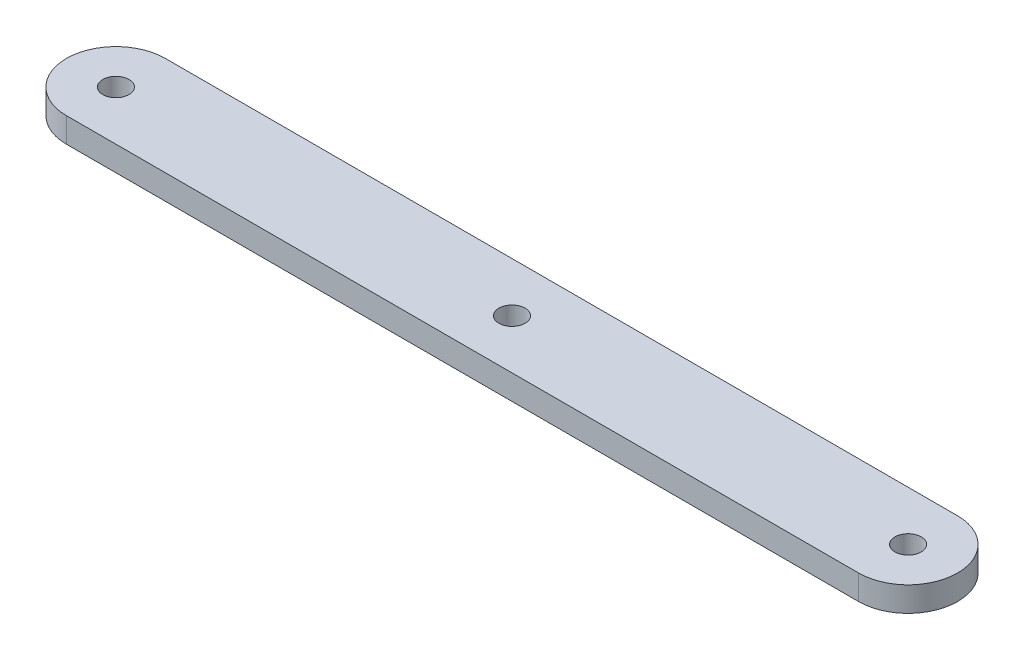
ISO-10303-21;
HEADER;
FILE_DESCRIPTION(('STEP AP214'),'2;1');
FILE_NAME('part.step','',(''),(''),'','','');
FILE_SCHEMA(('AUTOMOTIVE_DESIGN { 1 0 10303 214 1 1 1 1 }'));
ENDSEC;
DATA;
#1=APPLICATION_CONTEXT('core data for automotive mechanical design processes');
#2=APPLICATION_PROTOCOL_DEFINITION('international standard','automotive_design',2000,#1);
#3=PRODUCT_CONTEXT('',#1,'mechanical');
#4=PRODUCT('Part','Part','',(#3));
#5=PRODUCT_RELATED_PRODUCT_CATEGORY('part','',(#4));
#6=PRODUCT_DEFINITION_FORMATION('','',#4);
#7=PRODUCT_DEFINITION_CONTEXT('part definition',#1,'design');
#8=PRODUCT_DEFINITION('design','',#6,#7);
#9=PRODUCT_DEFINITION_SHAPE('','',#8);
#10=(LENGTH_UNIT() NAMED_UNIT(*) SI_UNIT(.MILLI.,.METRE.));
#11=(NAMED_UNIT(*) PLANE_ANGLE_UNIT() SI_UNIT($,.RADIAN.));
#12=(NAMED_UNIT(*) SI_UNIT($,.STERADIAN.) SOLID_ANGLE_UNIT());
#13=UNCERTAINTY_MEASURE_WITH_UNIT(LENGTH_MEASURE(1.E-05),#10,'distance_accuracy_value','');
#14=(GEOMETRIC_REPRESENTATION_CONTEXT(3) GLOBAL_UNCERTAINTY_ASSIGNED_CONTEXT((#13)) GLOBAL_UNIT_ASSIGNED_CONTEXT((#10,
#11,#12)) REPRESENTATION_CONTEXT('',''));
#15=CARTESIAN_POINT('',(0.,0.,0.));
#16=DIRECTION('',(0.,0.,1.));
#17=DIRECTION('',(1.,0.,0.));
#18=AXIS2_PLACEMENT_3D('',#15,#16,#17);
#19=CARTESIAN_POINT('',(-101.6,6.35,0.));
#20=DIRECTION('',(0.,1.,0.));
#21=DIRECTION('',(0.,0.,1.));
#22=AXIS2_PLACEMENT_3D('',#19,#20,#21);
#23=PLANE('',#22);
#24=CARTESIAN_POINT('',(-101.6,6.35,0.));
#25=DIRECTION('',(0.,1.,0.));
#26=DIRECTION('',(0.,0.,1.));
#27=AXIS2_PLACEMENT_3D('',#24,#25,#26);
#28=CIRCLE('',#27,3.36550000000002);
#29=CARTESIAN_POINT('',(-101.6,6.35,3.36550000000002));
#30=VERTEX_POINT('',#29);
#31=EDGE_CURVE('E134',#30,#30,#28,.T.);
#32=ORIENTED_EDGE('',*,*,#31,.F.);
#33=EDGE_LOOP('',(#32));
#34=FACE_BOUND('',#33,.T.);
#35=CARTESIAN_POINT('',(-101.6,6.35,0.));
#36=DIRECTION('',(0.,1.,0.));
#37=DIRECTION('',(0.,0.,1.));
#38=AXIS2_PLACEMENT_3D('',#35,#36,#37);
#39=CIRCLE('',#38,12.7);
#40=CARTESIAN_POINT('',(-101.6,6.35,-12.7000000000001));
#41=VERTEX_POINT('',#40);
#42=CARTESIAN_POINT('',(-101.6,6.35,12.6999999999999));
#43=VERTEX_POINT('',#42);
#44=EDGE_CURVE('E94',#41,#43,#39,.T.);
#45=ORIENTED_EDGE('',*,*,#44,.T.);
#46=DIRECTION('',(1.,0.,0.));
#47=VECTOR('',#46,1.);
#48=CARTESIAN_POINT('',(-101.6,6.35,12.6999999999999));
#49=LINE('',#48,#47);
#50=CARTESIAN_POINT('',(101.6,6.35,12.7));
#51=VERTEX_POINT('',#50);
#52=EDGE_CURVE('E89',#43,#51,#49,.T.);
#53=ORIENTED_EDGE('',*,*,#52,.T.);
#54=CARTESIAN_POINT('',(101.6,6.35,0.));
#55=DIRECTION('',(0.,1.,0.));
#56=DIRECTION('',(0.,0.,1.));
#57=AXIS2_PLACEMENT_3D('',#54,#55,#56);
#58=CIRCLE('',#57,12.7);
#59=CARTESIAN_POINT('',(101.6,6.35,-12.7000000000002));
#60=VERTEX_POINT('',#59);
#61=EDGE_CURVE('E92',#51,#60,#58,.T.);
#62=ORIENTED_EDGE('',*,*,#61,.T.);
#63=DIRECTION('',(-1.,0.,0.));
#64=VECTOR('',#63,1.);
#65=CARTESIAN_POINT('',(-101.6,6.35,-12.7000000000001));
#66=LINE('',#65,#64);
#67=EDGE_CURVE('E56',#60,#41,#66,.T.);
#68=ORIENTED_EDGE('',*,*,#67,.T.);
#69=EDGE_LOOP('',(#45,#53,#62,#68));
#70=FACE_BOUND('',#69,.T.);
#71=CARTESIAN_POINT('',(101.6,6.35,0.));
#72=DIRECTION('',(0.,1.,0.));
#73=DIRECTION('',(0.,0.,1.));
#74=AXIS2_PLACEMENT_3D('',#71,#72,#73);
#75=CIRCLE('',#74,3.36550000000002);
#76=CARTESIAN_POINT('',(101.6,6.35,3.36550000000002));
#77=VERTEX_POINT('',#76);
#78=EDGE_CURVE('E115',#77,#77,#75,.T.);
#79=ORIENTED_EDGE('',*,*,#78,.F.);
#80=EDGE_LOOP('',(#79));
#81=FACE_BOUND('',#80,.T.);
#82=CARTESIAN_POINT('',(0.,6.35,0.));
#83=DIRECTION('',(0.,1.,0.));
#84=DIRECTION('',(0.,0.,1.));
#85=AXIS2_PLACEMENT_3D('',#82,#83,#84);
#86=CIRCLE('',#85,3.3655);
#87=CARTESIAN_POINT('',(0.,6.35,3.3655));
#88=VERTEX_POINT('',#87);
#89=EDGE_CURVE('E140',#88,#88,#86,.T.);
#90=ORIENTED_EDGE('',*,*,#89,.F.);
#91=EDGE_LOOP('',(#90));
#92=FACE_BOUND('',#91,.T.);
#93=ADVANCED_FACE('F39',(#34,#70,#81,#92),#23,.T.);
#94=CARTESIAN_POINT('',(-101.6,0.,0.));
#95=DIRECTION('',(0.,1.,0.));
#96=DIRECTION('',(0.,0.,1.));
#97=AXIS2_PLACEMENT_3D('',#94,#95,#96);
#98=PLANE('',#97);
#99=CARTESIAN_POINT('',(-101.6,0.,0.));
#100=DIRECTION('',(0.,1.,0.));
#101=DIRECTION('',(0.,0.,1.));
#102=AXIS2_PLACEMENT_3D('',#99,#100,#101);
#103=CIRCLE('',#102,12.7);
#104=CARTESIAN_POINT('',(-101.6,0.,-12.7000000000001));
#105=VERTEX_POINT('',#104);
#106=CARTESIAN_POINT('',(-101.6,0.,12.6999999999999));
#107=VERTEX_POINT('',#106);
#108=EDGE_CURVE('E112',#105,#107,#103,.T.);
#109=ORIENTED_EDGE('',*,*,#108,.F.);
#110=DIRECTION('',(-1.,0.,0.));
#111=VECTOR('',#110,1.);
#112=CARTESIAN_POINT('',(-101.6,0.,-12.7000000000001));
#113=LINE('',#112,#111);
#114=CARTESIAN_POINT('',(101.6,0.,-12.7000000000002));
#115=VERTEX_POINT('',#114);
#116=EDGE_CURVE('E82',#115,#105,#113,.T.);
#117=ORIENTED_EDGE('',*,*,#116,.F.);
#118=CARTESIAN_POINT('',(101.6,0.,0.));
#119=DIRECTION('',(0.,1.,0.));
#120=DIRECTION('',(0.,0.,1.));
#121=AXIS2_PLACEMENT_3D('',#118,#119,#120);
#122=CIRCLE('',#121,12.7);
#123=CARTESIAN_POINT('',(101.6,0.,12.7));
#124=VERTEX_POINT('',#123);
#125=EDGE_CURVE('E76',#124,#115,#122,.T.);
#126=ORIENTED_EDGE('',*,*,#125,.F.);
#127=DIRECTION('',(1.,0.,0.));
#128=VECTOR('',#127,1.);
#129=CARTESIAN_POINT('',(-101.6,0.,12.6999999999999));
#130=LINE('',#129,#128);
#131=EDGE_CURVE('E99',#107,#124,#130,.T.);
#132=ORIENTED_EDGE('',*,*,#131,.F.);
#133=EDGE_LOOP('',(#109,#117,#126,#132));
#134=FACE_BOUND('',#133,.T.);
#135=CARTESIAN_POINT('',(101.6,0.,0.));
#136=DIRECTION('',(0.,1.,0.));
#137=DIRECTION('',(0.,0.,1.));
#138=AXIS2_PLACEMENT_3D('',#135,#136,#137);
#139=CIRCLE('',#138,3.36550000000002);
#140=CARTESIAN_POINT('',(101.6,0.,3.36550000000002));
#141=VERTEX_POINT('',#140);
#142=EDGE_CURVE('E130',#141,#141,#139,.T.);
#143=ORIENTED_EDGE('',*,*,#142,.T.);
#144=EDGE_LOOP('',(#143));
#145=FACE_BOUND('',#144,.T.);
#146=CARTESIAN_POINT('',(-101.6,0.,0.));
#147=DIRECTION('',(0.,1.,0.));
#148=DIRECTION('',(0.,0.,1.));
#149=AXIS2_PLACEMENT_3D('',#146,#147,#148);
#150=CIRCLE('',#149,3.36550000000002);
#151=CARTESIAN_POINT('',(-101.6,0.,3.36550000000002));
#152=VERTEX_POINT('',#151);
#153=EDGE_CURVE('E137',#152,#152,#150,.T.);
#154=ORIENTED_EDGE('',*,*,#153,.T.);
#155=EDGE_LOOP('',(#154));
#156=FACE_BOUND('',#155,.T.);
#157=CARTESIAN_POINT('',(0.,0.,0.));
#158=DIRECTION('',(0.,1.,0.));
#159=DIRECTION('',(0.,0.,1.));
#160=AXIS2_PLACEMENT_3D('',#157,#158,#159);
#161=CIRCLE('',#160,3.3655);
#162=CARTESIAN_POINT('',(0.,0.,3.3655));
#163=VERTEX_POINT('',#162);
#164=EDGE_CURVE('E143',#163,#163,#161,.T.);
#165=ORIENTED_EDGE('',*,*,#164,.T.);
#166=EDGE_LOOP('',(#165));
#167=FACE_BOUND('',#166,.T.);
#168=ADVANCED_FACE('F126',(#134,#145,#156,#167),#98,.F.);
#169=CARTESIAN_POINT('',(-101.6,6.35,0.));
#170=DIRECTION('',(0.,-1.,0.));
#171=DIRECTION('',(0.,0.,-1.));
#172=AXIS2_PLACEMENT_3D('',#169,#170,#171);
#173=CYLINDRICAL_SURFACE('',#172,12.7);
#174=ORIENTED_EDGE('',*,*,#108,.T.);
#175=DIRECTION('',(0.,-1.,0.));
#176=VECTOR('',#175,1.);
#177=CARTESIAN_POINT('',(-101.6,6.35,12.6999999999999));
#178=LINE('',#177,#176);
#179=EDGE_CURVE('E11',#43,#107,#178,.T.);
#180=ORIENTED_EDGE('',*,*,#179,.F.);
#181=ORIENTED_EDGE('',*,*,#44,.F.);
#182=DIRECTION('',(0.,-1.,0.));
#183=VECTOR('',#182,1.);
#184=CARTESIAN_POINT('',(-101.6,6.35,-12.7000000000001));
#185=LINE('',#184,#183);
#186=EDGE_CURVE('E108',#41,#105,#185,.T.);
#187=ORIENTED_EDGE('',*,*,#186,.T.);
#188=EDGE_LOOP('',(#174,#180,#181,#187));
#189=FACE_BOUND('',#188,.T.);
#190=ADVANCED_FACE('F41',(#189),#173,.T.);
#191=CARTESIAN_POINT('',(-101.6,6.35,12.6999999999999));
#192=DIRECTION('',(0.,0.,-1.));
#193=DIRECTION('',(-1.,0.,0.));
#194=AXIS2_PLACEMENT_3D('',#191,#192,#193);
#195=PLANE('',#194);
#196=ORIENTED_EDGE('',*,*,#131,.T.);
#197=DIRECTION('',(0.,-1.,0.));
#198=VECTOR('',#197,1.);
#199=CARTESIAN_POINT('',(101.6,6.35,12.7));
#200=LINE('',#199,#198);
#201=EDGE_CURVE('E48',#51,#124,#200,.T.);
#202=ORIENTED_EDGE('',*,*,#201,.F.);
#203=ORIENTED_EDGE('',*,*,#52,.F.);
#204=ORIENTED_EDGE('',*,*,#179,.T.);
#205=EDGE_LOOP('',(#196,#202,#203,#204));
#206=FACE_BOUND('',#205,.T.);
#207=ADVANCED_FACE('F98',(#206),#195,.F.);
#208=CARTESIAN_POINT('',(101.6,6.35,0.));
#209=DIRECTION('',(0.,-1.,0.));
#210=DIRECTION('',(0.,0.,-1.));
#211=AXIS2_PLACEMENT_3D('',#208,#209,#210);
#212=CYLINDRICAL_SURFACE('',#211,12.7);
#213=ORIENTED_EDGE('',*,*,#125,.T.);
#214=DIRECTION('',(0.,-1.,0.));
#215=VECTOR('',#214,1.);
#216=CARTESIAN_POINT('',(101.6,6.35,-12.7000000000002));
#217=LINE('',#216,#215);
#218=EDGE_CURVE('E101',#60,#115,#217,.T.);
#219=ORIENTED_EDGE('',*,*,#218,.F.);
#220=ORIENTED_EDGE('',*,*,#61,.F.);
#221=ORIENTED_EDGE('',*,*,#201,.T.);
#222=EDGE_LOOP('',(#213,#219,#220,#221));
#223=FACE_BOUND('',#222,.T.);
#224=ADVANCED_FACE('F102',(#223),#212,.T.);
#225=CARTESIAN_POINT('',(-101.6,6.35,-12.7000000000001));
#226=DIRECTION('',(0.,0.,1.));
#227=DIRECTION('',(1.,0.,0.));
#228=AXIS2_PLACEMENT_3D('',#225,#226,#227);
#229=PLANE('',#228);
#230=ORIENTED_EDGE('',*,*,#116,.T.);
#231=ORIENTED_EDGE('',*,*,#186,.F.);
#232=ORIENTED_EDGE('',*,*,#67,.F.);
#233=ORIENTED_EDGE('',*,*,#218,.T.);
#234=EDGE_LOOP('',(#230,#231,#232,#233));
#235=FACE_BOUND('',#234,.T.);
#236=ADVANCED_FACE('F123',(#235),#229,.F.);
#237=CARTESIAN_POINT('',(101.6,6.35,0.));
#238=DIRECTION('',(0.,-1.,0.));
#239=DIRECTION('',(0.,0.,-1.));
#240=AXIS2_PLACEMENT_3D('',#237,#238,#239);
#241=CYLINDRICAL_SURFACE('',#240,3.36550000000002);
#242=ORIENTED_EDGE('',*,*,#78,.T.);
#243=EDGE_LOOP('',(#242));
#244=FACE_BOUND('',#243,.T.);
#245=ORIENTED_EDGE('',*,*,#142,.F.);
#246=EDGE_LOOP('',(#245));
#247=FACE_BOUND('',#246,.T.);
#248=ADVANCED_FACE('F163',(#244,#247),#241,.F.);
#249=CARTESIAN_POINT('',(-101.6,6.35,0.));
#250=DIRECTION('',(0.,-1.,0.));
#251=DIRECTION('',(0.,0.,-1.));
#252=AXIS2_PLACEMENT_3D('',#249,#250,#251);
#253=CYLINDRICAL_SURFACE('',#252,3.36550000000002);
#254=ORIENTED_EDGE('',*,*,#31,.T.);
#255=EDGE_LOOP('',(#254));
#256=FACE_BOUND('',#255,.T.);
#257=ORIENTED_EDGE('',*,*,#153,.F.);
#258=EDGE_LOOP('',(#257));
#259=FACE_BOUND('',#258,.T.);
#260=ADVANCED_FACE('F197',(#256,#259),#253,.F.);
#261=CARTESIAN_POINT('',(0.,6.35,0.));
#262=DIRECTION('',(0.,-1.,0.));
#263=DIRECTION('',(0.,0.,-1.));
#264=AXIS2_PLACEMENT_3D('',#261,#262,#263);
#265=CYLINDRICAL_SURFACE('',#264,3.3655);
#266=ORIENTED_EDGE('',*,*,#89,.T.);
#267=EDGE_LOOP('',(#266));
#268=FACE_BOUND('',#267,.T.);
#269=ORIENTED_EDGE('',*,*,#164,.F.);
#270=EDGE_LOOP('',(#269));
#271=FACE_BOUND('',#270,.T.);
#272=ADVANCED_FACE('F151',(#268,#271),#265,.F.);
#273=CLOSED_SHELL('',(#93,#168,#190,#207,#224,#236,#248,#260,#272));
#274=MANIFOLD_SOLID_BREP('B2',#273);
#275=ADVANCED_BREP_SHAPE_REPRESENTATION('',(#18,#274),#14);
#276=SHAPE_DEFINITION_REPRESENTATION(#9,#275);
ENDSEC;
END-ISO-10303-21;
